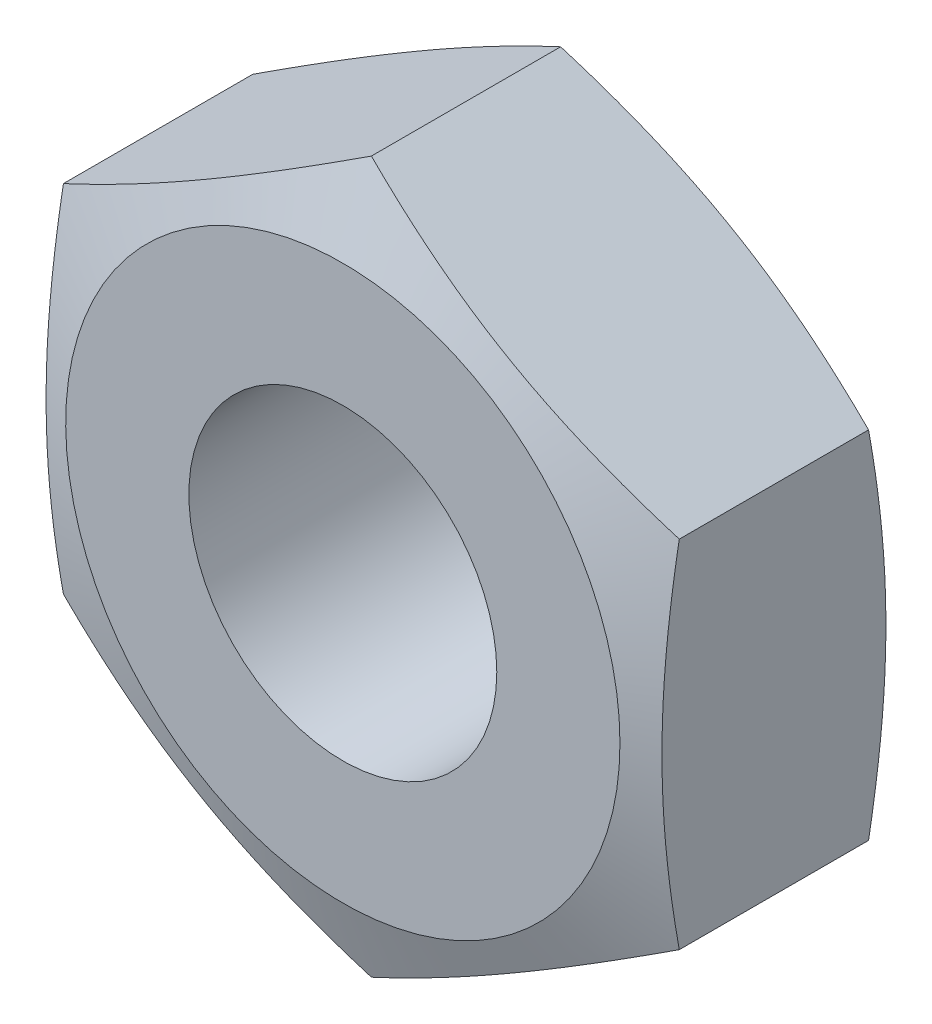
ISO-10303-21;
HEADER;
FILE_DESCRIPTION(('STEP AP214'),'2;1');
FILE_NAME('part.step','',(''),(''),'','','');
FILE_SCHEMA(('AUTOMOTIVE_DESIGN { 1 0 10303 214 1 1 1 1 }'));
ENDSEC;
DATA;
#1=APPLICATION_CONTEXT('core data for automotive mechanical design processes');
#2=APPLICATION_PROTOCOL_DEFINITION('international standard','automotive_design',2000,#1);
#3=PRODUCT_CONTEXT('',#1,'mechanical');
#4=PRODUCT('Part','Part','',(#3));
#5=PRODUCT_RELATED_PRODUCT_CATEGORY('part','',(#4));
#6=PRODUCT_DEFINITION_FORMATION('','',#4);
#7=PRODUCT_DEFINITION_CONTEXT('part definition',#1,'design');
#8=PRODUCT_DEFINITION('design','',#6,#7);
#9=PRODUCT_DEFINITION_SHAPE('','',#8);
#10=(LENGTH_UNIT() NAMED_UNIT(*) SI_UNIT(.MILLI.,.METRE.));
#11=(NAMED_UNIT(*) PLANE_ANGLE_UNIT() SI_UNIT($,.RADIAN.));
#12=(NAMED_UNIT(*) SI_UNIT($,.STERADIAN.) SOLID_ANGLE_UNIT());
#13=UNCERTAINTY_MEASURE_WITH_UNIT(LENGTH_MEASURE(1.E-05),#10,'distance_accuracy_value','');
#14=(GEOMETRIC_REPRESENTATION_CONTEXT(3) GLOBAL_UNCERTAINTY_ASSIGNED_CONTEXT((#13)) GLOBAL_UNIT_ASSIGNED_CONTEXT((#10,
#11,#12)) REPRESENTATION_CONTEXT('',''));
#15=CARTESIAN_POINT('',(0.,0.,0.));
#16=DIRECTION('',(0.,0.,1.));
#17=DIRECTION('',(1.,0.,0.));
#18=AXIS2_PLACEMENT_3D('',#15,#16,#17);
#19=CARTESIAN_POINT('',(2.,1.15470053837925,1.6));
#20=DIRECTION('',(-0.5,-0.866025403784439,0.));
#21=DIRECTION('',(0.866025403784439,-0.5,0.));
#22=AXIS2_PLACEMENT_3D('',#19,#20,#21);
#23=PLANE('',#22);
#24=DIRECTION('',(0.,0.,-1.));
#25=VECTOR('',#24,1.);
#26=CARTESIAN_POINT('',(2.,1.15470053837925,1.6));
#27=LINE('',#26,#25);
#28=CARTESIAN_POINT('',(2.,1.15470053837925,1.41459317075676));
#29=VERTEX_POINT('',#28);
#30=CARTESIAN_POINT('',(2.,1.15470053837925,0.185406829243245));
#31=VERTEX_POINT('',#30);
#32=EDGE_CURVE('E100',#29,#31,#27,.T.);
#33=ORIENTED_EDGE('',*,*,#32,.T.);
#34=CARTESIAN_POINT('',(2.0002,1.15458506832541,0.185448860057708));
#35=CARTESIAN_POINT('',(1.91735915372597,1.20241325322162,0.168032497453669));
#36=CARTESIAN_POINT('',(1.83424509422707,1.25039917784676,0.152189163754237));
#37=CARTESIAN_POINT('',(1.66747643878361,1.34668310595943,0.124315100500139));
#38=CARTESIAN_POINT('',(1.58382147164006,1.39498132375881,0.112287355790318));
#39=CARTESIAN_POINT('',(1.41689959323819,1.49135371518776,0.0928327625088443));
#40=CARTESIAN_POINT('',(1.33363649593117,1.53942568683154,0.0853634711754725));
#41=CARTESIAN_POINT('',(1.16691554252369,1.6356820741609,0.0753450362594957));
#42=CARTESIAN_POINT('',(1.08345777126184,1.68386644086489,0.0727940468532392));
#43=CARTESIAN_POINT('',(0.916542228738157,1.78023517427287,0.0727940468532392));
#44=CARTESIAN_POINT('',(0.833084457476315,1.82841954097686,0.0753450362594957));
#45=CARTESIAN_POINT('',(0.666363504068834,1.92467592830622,0.0853634711754725));
#46=CARTESIAN_POINT('',(0.583100406761807,1.97274789994999,0.0928327625088443));
#47=CARTESIAN_POINT('',(0.416178528359942,2.06912029137895,0.112287355790318));
#48=CARTESIAN_POINT('',(0.332523561216389,2.11741850917833,0.124315100500139));
#49=CARTESIAN_POINT('',(0.165754905772934,2.213702437291,0.152189163754237));
#50=CARTESIAN_POINT('',(0.0826408462740323,2.26168836191613,0.168032497453669));
#51=CARTESIAN_POINT('',(-0.000200000000000283,2.30951654681234,0.185448860057708));
#52=B_SPLINE_CURVE_WITH_KNOTS('',3,(#34,#35,#36,#37,#38,#39,#40,#41,#42,#43,#44,#45,#46,#47,#48,
#49,#50,#51),.UNSPECIFIED.,.F.,.F.,(4,2,2,2,2,2,2,2,4),(0.,0.291716985835478,0.583661615412808,
0.872844804843114,1.16191944356588,1.45099408228865,1.74017727171896,2.03212190129629,
2.32383888713177),.UNSPECIFIED.);
#53=CARTESIAN_POINT('',(0.,2.3094010767585,0.185406829243245));
#54=VERTEX_POINT('',#53);
#55=EDGE_CURVE('E51',#31,#54,#52,.T.);
#56=ORIENTED_EDGE('',*,*,#55,.T.);
#57=DIRECTION('',(0.,0.,-1.));
#58=VECTOR('',#57,1.);
#59=CARTESIAN_POINT('',(0.,2.3094010767585,1.6));
#60=LINE('',#59,#58);
#61=CARTESIAN_POINT('',(0.,2.3094010767585,1.41459317075676));
#62=VERTEX_POINT('',#61);
#63=EDGE_CURVE('E11',#62,#54,#60,.T.);
#64=ORIENTED_EDGE('',*,*,#63,.F.);
#65=CARTESIAN_POINT('',(-0.000200000000000046,2.30951654681234,1.41455113994229));
#66=CARTESIAN_POINT('',(0.0826408462740324,2.26168836191613,1.43196750254633));
#67=CARTESIAN_POINT('',(0.165754905772934,2.213702437291,1.44781083624576));
#68=CARTESIAN_POINT('',(0.332523561216389,2.11741850917833,1.47568489949986));
#69=CARTESIAN_POINT('',(0.416178528359942,2.06912029137895,1.48771264420968));
#70=CARTESIAN_POINT('',(0.583100406761807,1.97274789994999,1.50716723749116));
#71=CARTESIAN_POINT('',(0.666363504068834,1.92467592830622,1.51463652882453));
#72=CARTESIAN_POINT('',(0.833084457476314,1.82841954097686,1.5246549637405));
#73=CARTESIAN_POINT('',(0.916542228738157,1.78023517427287,1.52720595314676));
#74=CARTESIAN_POINT('',(1.08345777126184,1.68386644086489,1.52720595314676));
#75=CARTESIAN_POINT('',(1.16691554252369,1.6356820741609,1.5246549637405));
#76=CARTESIAN_POINT('',(1.33363649593117,1.53942568683154,1.51463652882453));
#77=CARTESIAN_POINT('',(1.41689959323819,1.49135371518776,1.50716723749116));
#78=CARTESIAN_POINT('',(1.58382147164006,1.39498132375881,1.48771264420968));
#79=CARTESIAN_POINT('',(1.66747643878361,1.34668310595943,1.47568489949986));
#80=CARTESIAN_POINT('',(1.83424509422707,1.25039917784676,1.44781083624576));
#81=CARTESIAN_POINT('',(1.91735915372597,1.20241325322162,1.43196750254633));
#82=CARTESIAN_POINT('',(2.0002,1.15458506832541,1.41455113994229));
#83=B_SPLINE_CURVE_WITH_KNOTS('',3,(#65,#66,#67,#68,#69,#70,#71,#72,#73,#74,#75,#76,#77,#78,#79,
#80,#81,#82),.UNSPECIFIED.,.F.,.F.,(4,2,2,2,2,2,2,2,4),(0.,0.291716985835478,0.583661615412808,
0.872844804843114,1.16191944356588,1.45099408228865,1.74017727171896,2.03212190129629,
2.32383888713177),.UNSPECIFIED.);
#84=EDGE_CURVE('E107',#62,#29,#83,.T.);
#85=ORIENTED_EDGE('',*,*,#84,.T.);
#86=EDGE_LOOP('',(#33,#56,#64,#85));
#87=FACE_BOUND('',#86,.T.);
#88=ADVANCED_FACE('F36',(#87),#23,.F.);
#89=CARTESIAN_POINT('',(0.,2.3094010767585,1.6));
#90=DIRECTION('',(0.5,-0.866025403784439,0.));
#91=DIRECTION('',(0.866025403784439,0.5,0.));
#92=AXIS2_PLACEMENT_3D('',#89,#90,#91);
#93=PLANE('',#92);
#94=ORIENTED_EDGE('',*,*,#63,.T.);
#95=CARTESIAN_POINT('',(0.000200000000000007,2.30951654681234,0.185448860057708));
#96=CARTESIAN_POINT('',(-0.0826408462740327,2.26168836191613,0.168032497453669));
#97=CARTESIAN_POINT('',(-0.165754905772935,2.213702437291,0.152189163754237));
#98=CARTESIAN_POINT('',(-0.33252356121639,2.11741850917833,0.124315100500139));
#99=CARTESIAN_POINT('',(-0.416178528359942,2.06912029137895,0.112287355790318));
#100=CARTESIAN_POINT('',(-0.583100406761807,1.97274789994999,0.0928327625088444));
#101=CARTESIAN_POINT('',(-0.666363504068834,1.92467592830622,0.0853634711754725));
#102=CARTESIAN_POINT('',(-0.833084457476315,1.82841954097686,0.0753450362594958));
#103=CARTESIAN_POINT('',(-0.916542228738157,1.78023517427287,0.0727940468532393));
#104=CARTESIAN_POINT('',(-1.08345777126184,1.68386644086489,0.0727940468532393));
#105=CARTESIAN_POINT('',(-1.16691554252369,1.6356820741609,0.0753450362594958));
#106=CARTESIAN_POINT('',(-1.33363649593117,1.53942568683154,0.0853634711754726));
#107=CARTESIAN_POINT('',(-1.41689959323819,1.49135371518776,0.0928327625088445));
#108=CARTESIAN_POINT('',(-1.58382147164006,1.39498132375881,0.112287355790318));
#109=CARTESIAN_POINT('',(-1.66747643878361,1.34668310595943,0.12431510050014));
#110=CARTESIAN_POINT('',(-1.83424509422707,1.25039917784676,0.152189163754238));
#111=CARTESIAN_POINT('',(-1.91735915372597,1.20241325322162,0.168032497453669));
#112=CARTESIAN_POINT('',(-2.0002,1.15458506832541,0.185448860057708));
#113=B_SPLINE_CURVE_WITH_KNOTS('',3,(#95,#96,#97,#98,#99,#100,#101,#102,#103,#104,#105,#106,
#107,#108,#109,#110,#111,#112),.UNSPECIFIED.,.F.,.F.,(4,2,2,2,2,2,2,2,4),(0.,0.291716985835479,
0.583661615412808,0.872844804843114,1.16191944356588,1.45099408228865,1.74017727171896,
2.03212190129629,2.32383888713177),.UNSPECIFIED.);
#114=CARTESIAN_POINT('',(-2.,1.15470053837925,0.185406829243245));
#115=VERTEX_POINT('',#114);
#116=EDGE_CURVE('E87',#54,#115,#113,.T.);
#117=ORIENTED_EDGE('',*,*,#116,.T.);
#118=DIRECTION('',(0.,0.,-1.));
#119=VECTOR('',#118,1.);
#120=CARTESIAN_POINT('',(-2.,1.15470053837925,1.6));
#121=LINE('',#120,#119);
#122=CARTESIAN_POINT('',(-2.,1.15470053837925,1.41459317075676));
#123=VERTEX_POINT('',#122);
#124=EDGE_CURVE('E44',#123,#115,#121,.T.);
#125=ORIENTED_EDGE('',*,*,#124,.F.);
#126=CARTESIAN_POINT('',(-2.0002,1.15458506832541,1.41455113994229));
#127=CARTESIAN_POINT('',(-1.91735915372597,1.20241325322162,1.43196750254633));
#128=CARTESIAN_POINT('',(-1.83424509422707,1.25039917784676,1.44781083624576));
#129=CARTESIAN_POINT('',(-1.66747643878361,1.34668310595943,1.47568489949986));
#130=CARTESIAN_POINT('',(-1.58382147164006,1.39498132375881,1.48771264420968));
#131=CARTESIAN_POINT('',(-1.41689959323819,1.49135371518776,1.50716723749116));
#132=CARTESIAN_POINT('',(-1.33363649593117,1.53942568683154,1.51463652882453));
#133=CARTESIAN_POINT('',(-1.16691554252369,1.6356820741609,1.5246549637405));
#134=CARTESIAN_POINT('',(-1.08345777126184,1.68386644086489,1.52720595314676));
#135=CARTESIAN_POINT('',(-0.916542228738157,1.78023517427287,1.52720595314676));
#136=CARTESIAN_POINT('',(-0.833084457476314,1.82841954097686,1.5246549637405));
#137=CARTESIAN_POINT('',(-0.666363504068834,1.92467592830622,1.51463652882453));
#138=CARTESIAN_POINT('',(-0.583100406761807,1.97274789994999,1.50716723749116));
#139=CARTESIAN_POINT('',(-0.416178528359942,2.06912029137895,1.48771264420968));
#140=CARTESIAN_POINT('',(-0.332523561216389,2.11741850917833,1.47568489949986));
#141=CARTESIAN_POINT('',(-0.165754905772934,2.213702437291,1.44781083624576));
#142=CARTESIAN_POINT('',(-0.0826408462740324,2.26168836191613,1.43196750254633));
#143=CARTESIAN_POINT('',(0.000200000000000356,2.30951654681234,1.41455113994229));
#144=B_SPLINE_CURVE_WITH_KNOTS('',3,(#126,#127,#128,#129,#130,#131,#132,#133,#134,#135,#136,
#137,#138,#139,#140,#141,#142,#143),.UNSPECIFIED.,.F.,.F.,(4,2,2,2,2,2,2,2,4),(0.,
0.291716985835479,0.583661615412808,0.872844804843114,1.16191944356588,1.45099408228865,
1.74017727171896,2.03212190129629,2.32383888713177),.UNSPECIFIED.);
#145=EDGE_CURVE('E105',#123,#62,#144,.T.);
#146=ORIENTED_EDGE('',*,*,#145,.T.);
#147=EDGE_LOOP('',(#94,#117,#125,#146));
#148=FACE_BOUND('',#147,.T.);
#149=ADVANCED_FACE('F104',(#148),#93,.F.);
#150=CARTESIAN_POINT('',(-2.,1.15470053837925,1.6));
#151=DIRECTION('',(1.,0.,0.));
#152=DIRECTION('',(0.,0.,-1.));
#153=AXIS2_PLACEMENT_3D('',#150,#151,#152);
#154=PLANE('',#153);
#155=ORIENTED_EDGE('',*,*,#124,.T.);
#156=CARTESIAN_POINT('',(-2.,-3.05031162677116,0.672442230833341));
#157=CARTESIAN_POINT('',(-2.,-2.95989490218837,0.644928781621238));
#158=CARTESIAN_POINT('',(-2.,-2.86937822648628,0.617738484155107));
#159=CARTESIAN_POINT('',(-2.,-2.68809399605257,0.564181531550267));
#160=CARTESIAN_POINT('',(-2.,-2.59732642193118,0.537814942122395));
#161=CARTESIAN_POINT('',(-2.,-2.41533254134479,0.486038459734253));
#162=CARTESIAN_POINT('',(-2.,-2.32410569283579,0.460630462485751));
#163=CARTESIAN_POINT('',(-2.,-2.14131199638906,0.411076127854906));
#164=CARTESIAN_POINT('',(-2.,-2.04974515463943,0.386929767629361));
#165=CARTESIAN_POINT('',(-2.,-1.7767394508647,0.317402866114399));
#166=CARTESIAN_POINT('',(-2.,-1.59471676185193,0.27427186797954));
#167=CARTESIAN_POINT('',(-2.,-1.22866663109293,0.197458745362041));
#168=CARTESIAN_POINT('',(-2.,-1.04464009031412,0.163772542904175));
#169=CARTESIAN_POINT('',(-2.,-0.777440999728752,0.125375528147598));
#170=CARTESIAN_POINT('',(-2.,-0.695088061294178,0.114968442052623));
#171=CARTESIAN_POINT('',(-2.,-0.5300428651665,0.0973765876551359));
#172=CARTESIAN_POINT('',(-2.,-0.447350650850818,0.090191419626845));
#173=CARTESIAN_POINT('',(-2.,-0.281784370385069,0.0793865670193495));
#174=CARTESIAN_POINT('',(-2.,-0.198910458457961,0.0757645546304802));
#175=CARTESIAN_POINT('',(-2.,-0.0330826983595107,0.0722701306170606));
#176=CARTESIAN_POINT('',(-2.,0.0498711492808819,0.072397694256397));
#177=CARTESIAN_POINT('',(-2.,0.216111891745599,0.0764055645531487));
#178=CARTESIAN_POINT('',(-2.,0.299398315404806,0.0803050948444768));
#179=CARTESIAN_POINT('',(-2.,0.465727625088114,0.091678055629401));
#180=CARTESIAN_POINT('',(-2.,0.548770496202853,0.099151700504532));
#181=CARTESIAN_POINT('',(-2.,0.714568331999549,0.11732382152012));
#182=CARTESIAN_POINT('',(-2.,0.797322996390511,0.128025000152161));
#183=CARTESIAN_POINT('',(-2.,0.962417154472956,0.152223143304533));
#184=CARTESIAN_POINT('',(-2.,1.04475664618065,0.165720121170871));
#185=CARTESIAN_POINT('',(-2.,1.30100491224258,0.211494089126808));
#186=CARTESIAN_POINT('',(-2.,1.47417881069313,0.247873366845185));
#187=CARTESIAN_POINT('',(-2.,1.81891373011319,0.327623197419252));
#188=CARTESIAN_POINT('',(-2.,1.99047413904239,0.370996298320652));
#189=CARTESIAN_POINT('',(-2.,2.33257919607591,0.462393272044698));
#190=CARTESIAN_POINT('',(-2.,2.50312222940243,0.510423131074273));
#191=CARTESIAN_POINT('',(-2.,2.84327352184795,0.609557392962974));
#192=CARTESIAN_POINT('',(-2.,3.0128819264062,0.660661301818513));
#193=CARTESIAN_POINT('',(-2.,3.34951260232018,0.764399312077172));
#194=CARTESIAN_POINT('',(-2.,3.51654232342241,0.817009349169206));
#195=CARTESIAN_POINT('',(-2.,3.85013442656059,0.923713468364503));
#196=CARTESIAN_POINT('',(-2.,4.01669678547734,0.977807622504826));
#197=CARTESIAN_POINT('',(-2.,4.34883250367105,1.08686895790735));
#198=CARTESIAN_POINT('',(-2.,4.51440721447674,1.14183203356738));
#199=CARTESIAN_POINT('',(-2.,4.84526800434378,1.25257579516433));
#200=CARTESIAN_POINT('',(-2.,5.01055410611518,1.30835641319565));
#201=CARTESIAN_POINT('',(-2.,5.17574181927481,1.3644228160933));
#202=B_SPLINE_CURVE_WITH_KNOTS('',3,(#156,#157,#158,#159,#160,#161,#162,#163,#164,#165,#166,
#167,#168,#169,#170,#171,#172,#173,#174,#175,#176,#177,#178,#179,#180,#181,#182,#183,#184,#185,
#186,#187,#188,#189,#190,#191,#192,#193,#194,#195,#196,#197,#198,#199,#200,#201),.UNSPECIFIED.,
.F.,.F.,(4,2,2,2,2,2,2,2,2,2,2,2,2,2,2,2,2,2,2,2,2,2,4),(0.,0.283532151624477,0.567086864403373,
0.851175716010968,1.13525942212174,1.69631085076014,2.25711966010779,2.50609066615215,
2.75503077517164,3.00380814339452,3.25258387042284,3.50263418686682,3.75269950364003,
4.00297479017142,4.25325127144275,4.78385307907594,5.31464863841295,5.8461358115385,
6.37753780102535,6.90288601730338,7.42825977855363,7.95163426467287,8.47496552259563),.UNSPECIFIED.);
#203=CARTESIAN_POINT('',(-2.,-1.15470053837925,0.185406829243245));
#204=VERTEX_POINT('',#203);
#205=EDGE_CURVE('E90',#115,#204,#202,.F.);
#206=ORIENTED_EDGE('',*,*,#205,.T.);
#207=DIRECTION('',(0.,0.,-1.));
#208=VECTOR('',#207,1.);
#209=CARTESIAN_POINT('',(-2.,-1.15470053837925,1.6));
#210=LINE('',#209,#208);
#211=CARTESIAN_POINT('',(-2.,-1.15470053837925,1.41459317075676));
#212=VERTEX_POINT('',#211);
#213=EDGE_CURVE('E216',#212,#204,#210,.T.);
#214=ORIENTED_EDGE('',*,*,#213,.F.);
#215=CARTESIAN_POINT('',(-2.,-3.05031162677116,0.927557769166659));
#216=CARTESIAN_POINT('',(-2.,-2.95989490218837,0.955071218378762));
#217=CARTESIAN_POINT('',(-2.,-2.86937822648628,0.982261515844894));
#218=CARTESIAN_POINT('',(-2.,-2.68809399605256,1.03581846844973));
#219=CARTESIAN_POINT('',(-2.,-2.59732642193118,1.06218505787761));
#220=CARTESIAN_POINT('',(-2.,-2.41533254134479,1.11396154026575));
#221=CARTESIAN_POINT('',(-2.,-2.32410569283579,1.13936953751425));
#222=CARTESIAN_POINT('',(-2.,-2.14131199638906,1.18892387214509));
#223=CARTESIAN_POINT('',(-2.,-2.04974515463943,1.21307023237064));
#224=CARTESIAN_POINT('',(-2.,-1.7767394508647,1.2825971338856));
#225=CARTESIAN_POINT('',(-2.,-1.59471676185193,1.32572813202046));
#226=CARTESIAN_POINT('',(-2.,-1.22866663109293,1.40254125463796));
#227=CARTESIAN_POINT('',(-2.,-1.04464009031412,1.43622745709583));
#228=CARTESIAN_POINT('',(-2.,-0.777440999728752,1.4746244718524));
#229=CARTESIAN_POINT('',(-2.,-0.695088061294179,1.48503155794738));
#230=CARTESIAN_POINT('',(-2.,-0.530042865166501,1.50262341234486));
#231=CARTESIAN_POINT('',(-2.,-0.447350650850819,1.50980858037315));
#232=CARTESIAN_POINT('',(-2.,-0.28178437038507,1.52061343298065));
#233=CARTESIAN_POINT('',(-2.,-0.198910458457961,1.52423544536952));
#234=CARTESIAN_POINT('',(-2.,-0.0330826983595114,1.52772986938294));
#235=CARTESIAN_POINT('',(-2.,0.0498711492808811,1.5276023057436));
#236=CARTESIAN_POINT('',(-2.,0.216111891745599,1.52359443544685));
#237=CARTESIAN_POINT('',(-2.,0.299398315404805,1.51969490515552));
#238=CARTESIAN_POINT('',(-2.,0.465727625088113,1.5083219443706));
#239=CARTESIAN_POINT('',(-2.,0.548770496202853,1.50084829949547));
#240=CARTESIAN_POINT('',(-2.,0.714568331999549,1.48267617847988));
#241=CARTESIAN_POINT('',(-2.,0.797322996390511,1.47197499984784));
#242=CARTESIAN_POINT('',(-2.,0.962417154472955,1.44777685669547));
#243=CARTESIAN_POINT('',(-2.,1.04475664618065,1.43427987882913));
#244=CARTESIAN_POINT('',(-2.,1.30100491224258,1.38850591087319));
#245=CARTESIAN_POINT('',(-2.,1.47417881069313,1.35212663315482));
#246=CARTESIAN_POINT('',(-2.,1.81891373011319,1.27237680258075));
#247=CARTESIAN_POINT('',(-2.,1.99047413904238,1.22900370167935));
#248=CARTESIAN_POINT('',(-2.,2.33257919607591,1.1376067279553));
#249=CARTESIAN_POINT('',(-2.,2.50312222940243,1.08957686892573));
#250=CARTESIAN_POINT('',(-2.,2.84327352184795,0.990442607037026));
#251=CARTESIAN_POINT('',(-2.,3.0128819264062,0.939338698181486));
#252=CARTESIAN_POINT('',(-2.,3.34951260232018,0.835600687922827));
#253=CARTESIAN_POINT('',(-2.,3.51654232342241,0.782990650830793));
#254=CARTESIAN_POINT('',(-2.,3.85013442656059,0.676286531635496));
#255=CARTESIAN_POINT('',(-2.,4.01669678547735,0.622192377495174));
#256=CARTESIAN_POINT('',(-2.,4.34883250367105,0.51313104209265));
#257=CARTESIAN_POINT('',(-2.,4.51440721447674,0.458167966432621));
#258=CARTESIAN_POINT('',(-2.,4.84526800434378,0.34742420483567));
#259=CARTESIAN_POINT('',(-2.,5.01055410611518,0.291643586804349));
#260=CARTESIAN_POINT('',(-2.,5.17574181927481,0.235577183906703));
#261=B_SPLINE_CURVE_WITH_KNOTS('',3,(#215,#216,#217,#218,#219,#220,#221,#222,#223,#224,#225,
#226,#227,#228,#229,#230,#231,#232,#233,#234,#235,#236,#237,#238,#239,#240,#241,#242,#243,#244,
#245,#246,#247,#248,#249,#250,#251,#252,#253,#254,#255,#256,#257,#258,#259,#260),.UNSPECIFIED.,
.F.,.F.,(4,2,2,2,2,2,2,2,2,2,2,2,2,2,2,2,2,2,2,2,2,2,4),(0.,0.283532151624478,0.567086864403374,
0.85117571601097,1.13525942212175,1.69631085076014,2.25711966010779,2.50609066615215,
2.75503077517164,3.00380814339452,3.25258387042284,3.50263418686682,3.75269950364003,
4.00297479017142,4.25325127144275,4.78385307907594,5.31464863841295,5.8461358115385,
6.37753780102535,6.90288601730338,7.42825977855364,7.95163426467287,8.47496552259563),.UNSPECIFIED.);
#262=EDGE_CURVE('E108',#212,#123,#261,.T.);
#263=ORIENTED_EDGE('',*,*,#262,.T.);
#264=EDGE_LOOP('',(#155,#206,#214,#263));
#265=FACE_BOUND('',#264,.T.);
#266=ADVANCED_FACE('F170',(#265),#154,.F.);
#267=CARTESIAN_POINT('',(-2.,-1.15470053837925,1.6));
#268=DIRECTION('',(0.5,0.866025403784439,0.));
#269=DIRECTION('',(-0.866025403784439,0.5,0.));
#270=AXIS2_PLACEMENT_3D('',#267,#268,#269);
#271=PLANE('',#270);
#272=ORIENTED_EDGE('',*,*,#213,.T.);
#273=CARTESIAN_POINT('',(-2.0002,-1.15458506832541,0.185448860057708));
#274=CARTESIAN_POINT('',(-1.91735915372597,-1.20241325322162,0.168032497453669));
#275=CARTESIAN_POINT('',(-1.83424509422707,-1.25039917784676,0.152189163754237));
#276=CARTESIAN_POINT('',(-1.66747643878361,-1.34668310595943,0.124315100500139));
#277=CARTESIAN_POINT('',(-1.58382147164006,-1.39498132375881,0.112287355790318));
#278=CARTESIAN_POINT('',(-1.41689959323819,-1.49135371518776,0.0928327625088444));
#279=CARTESIAN_POINT('',(-1.33363649593117,-1.53942568683154,0.0853634711754726));
#280=CARTESIAN_POINT('',(-1.16691554252369,-1.63568207416089,0.0753450362594957));
#281=CARTESIAN_POINT('',(-1.08345777126184,-1.68386644086489,0.0727940468532391));
#282=CARTESIAN_POINT('',(-0.916542228738157,-1.78023517427287,0.0727940468532391));
#283=CARTESIAN_POINT('',(-0.833084457476315,-1.82841954097686,0.0753450362594957));
#284=CARTESIAN_POINT('',(-0.666363504068834,-1.92467592830622,0.0853634711754726));
#285=CARTESIAN_POINT('',(-0.583100406761807,-1.97274789994999,0.0928327625088444));
#286=CARTESIAN_POINT('',(-0.416178528359942,-2.06912029137895,0.112287355790318));
#287=CARTESIAN_POINT('',(-0.332523561216389,-2.11741850917833,0.124315100500139));
#288=CARTESIAN_POINT('',(-0.165754905772934,-2.213702437291,0.152189163754237));
#289=CARTESIAN_POINT('',(-0.0826408462740323,-2.26168836191613,0.168032497453669));
#290=CARTESIAN_POINT('',(0.000200000000000217,-2.30951654681234,0.185448860057708));
#291=B_SPLINE_CURVE_WITH_KNOTS('',3,(#273,#274,#275,#276,#277,#278,#279,#280,#281,#282,#283,
#284,#285,#286,#287,#288,#289,#290),.UNSPECIFIED.,.F.,.F.,(4,2,2,2,2,2,2,2,4),(0.,
0.291716985835479,0.583661615412808,0.872844804843114,1.16191944356588,1.45099408228865,
1.74017727171896,2.03212190129629,2.32383888713177),.UNSPECIFIED.);
#292=CARTESIAN_POINT('',(0.,-2.3094010767585,0.185406829243245));
#293=VERTEX_POINT('',#292);
#294=EDGE_CURVE('E176',#204,#293,#291,.T.);
#295=ORIENTED_EDGE('',*,*,#294,.T.);
#296=DIRECTION('',(0.,0.,-1.));
#297=VECTOR('',#296,1.);
#298=CARTESIAN_POINT('',(0.,-2.3094010767585,1.6));
#299=LINE('',#298,#297);
#300=CARTESIAN_POINT('',(0.,-2.3094010767585,1.41459317075676));
#301=VERTEX_POINT('',#300);
#302=EDGE_CURVE('E212',#301,#293,#299,.T.);
#303=ORIENTED_EDGE('',*,*,#302,.F.);
#304=CARTESIAN_POINT('',(0.000200000000000047,-2.30951654681234,1.41455113994229));
#305=CARTESIAN_POINT('',(-0.0826408462740324,-2.26168836191613,1.43196750254633));
#306=CARTESIAN_POINT('',(-0.165754905772934,-2.213702437291,1.44781083624576));
#307=CARTESIAN_POINT('',(-0.33252356121639,-2.11741850917833,1.47568489949986));
#308=CARTESIAN_POINT('',(-0.416178528359942,-2.06912029137895,1.48771264420968));
#309=CARTESIAN_POINT('',(-0.583100406761807,-1.97274789994999,1.50716723749116));
#310=CARTESIAN_POINT('',(-0.666363504068834,-1.92467592830622,1.51463652882453));
#311=CARTESIAN_POINT('',(-0.833084457476315,-1.82841954097686,1.5246549637405));
#312=CARTESIAN_POINT('',(-0.916542228738157,-1.78023517427287,1.52720595314676));
#313=CARTESIAN_POINT('',(-1.08345777126184,-1.68386644086489,1.52720595314676));
#314=CARTESIAN_POINT('',(-1.16691554252369,-1.63568207416089,1.5246549637405));
#315=CARTESIAN_POINT('',(-1.33363649593117,-1.53942568683153,1.51463652882453));
#316=CARTESIAN_POINT('',(-1.41689959323819,-1.49135371518776,1.50716723749116));
#317=CARTESIAN_POINT('',(-1.58382147164006,-1.39498132375881,1.48771264420968));
#318=CARTESIAN_POINT('',(-1.66747643878361,-1.34668310595943,1.47568489949986));
#319=CARTESIAN_POINT('',(-1.83424509422707,-1.25039917784676,1.44781083624576));
#320=CARTESIAN_POINT('',(-1.91735915372597,-1.20241325322162,1.43196750254633));
#321=CARTESIAN_POINT('',(-2.0002,-1.15458506832541,1.41455113994229));
#322=B_SPLINE_CURVE_WITH_KNOTS('',3,(#304,#305,#306,#307,#308,#309,#310,#311,#312,#313,#314,
#315,#316,#317,#318,#319,#320,#321),.UNSPECIFIED.,.F.,.F.,(4,2,2,2,2,2,2,2,4),(0.,
0.291716985835479,0.583661615412808,0.872844804843114,1.16191944356588,1.45099408228865,
1.74017727171896,2.03212190129629,2.32383888713177),.UNSPECIFIED.);
#323=EDGE_CURVE('E111',#301,#212,#322,.T.);
#324=ORIENTED_EDGE('',*,*,#323,.T.);
#325=EDGE_LOOP('',(#272,#295,#303,#324));
#326=FACE_BOUND('',#325,.T.);
#327=ADVANCED_FACE('F166',(#326),#271,.F.);
#328=CARTESIAN_POINT('',(0.,-2.3094010767585,1.6));
#329=DIRECTION('',(-0.5,0.866025403784439,0.));
#330=DIRECTION('',(-0.866025403784439,-0.5,0.));
#331=AXIS2_PLACEMENT_3D('',#328,#329,#330);
#332=PLANE('',#331);
#333=ORIENTED_EDGE('',*,*,#302,.T.);
#334=CARTESIAN_POINT('',(-0.000200000000000006,-2.30951654681234,0.185448860057708));
#335=CARTESIAN_POINT('',(0.0826408462740324,-2.26168836191613,0.168032497453669));
#336=CARTESIAN_POINT('',(0.165754905772934,-2.213702437291,0.152189163754237));
#337=CARTESIAN_POINT('',(0.332523561216389,-2.11741850917833,0.124315100500139));
#338=CARTESIAN_POINT('',(0.416178528359942,-2.06912029137895,0.112287355790318));
#339=CARTESIAN_POINT('',(0.583100406761807,-1.97274789994999,0.0928327625088445));
#340=CARTESIAN_POINT('',(0.666363504068834,-1.92467592830622,0.0853634711754728));
#341=CARTESIAN_POINT('',(0.833084457476314,-1.82841954097686,0.0753450362594959));
#342=CARTESIAN_POINT('',(0.916542228738157,-1.78023517427287,0.0727940468532393));
#343=CARTESIAN_POINT('',(1.08345777126184,-1.68386644086489,0.0727940468532393));
#344=CARTESIAN_POINT('',(1.16691554252369,-1.6356820741609,0.075345036259496));
#345=CARTESIAN_POINT('',(1.33363649593117,-1.53942568683154,0.0853634711754729));
#346=CARTESIAN_POINT('',(1.41689959323819,-1.49135371518776,0.0928327625088446));
#347=CARTESIAN_POINT('',(1.58382147164006,-1.39498132375881,0.112287355790318));
#348=CARTESIAN_POINT('',(1.66747643878361,-1.34668310595943,0.12431510050014));
#349=CARTESIAN_POINT('',(1.83424509422707,-1.25039917784676,0.152189163754237));
#350=CARTESIAN_POINT('',(1.91735915372597,-1.20241325322162,0.168032497453669));
#351=CARTESIAN_POINT('',(2.0002,-1.15458506832541,0.185448860057708));
#352=B_SPLINE_CURVE_WITH_KNOTS('',3,(#334,#335,#336,#337,#338,#339,#340,#341,#342,#343,#344,
#345,#346,#347,#348,#349,#350,#351),.UNSPECIFIED.,.F.,.F.,(4,2,2,2,2,2,2,2,4),(0.,
0.291716985835479,0.583661615412808,0.872844804843114,1.16191944356588,1.45099408228865,
1.74017727171896,2.03212190129629,2.32383888713177),.UNSPECIFIED.);
#353=CARTESIAN_POINT('',(2.,-1.15470053837925,0.185406829243245));
#354=VERTEX_POINT('',#353);
#355=EDGE_CURVE('E184',#293,#354,#352,.T.);
#356=ORIENTED_EDGE('',*,*,#355,.T.);
#357=DIRECTION('',(0.,0.,-1.));
#358=VECTOR('',#357,1.);
#359=CARTESIAN_POINT('',(2.,-1.15470053837925,1.6));
#360=LINE('',#359,#358);
#361=CARTESIAN_POINT('',(2.,-1.15470053837925,1.41459317075676));
#362=VERTEX_POINT('',#361);
#363=EDGE_CURVE('E213',#362,#354,#360,.T.);
#364=ORIENTED_EDGE('',*,*,#363,.F.);
#365=CARTESIAN_POINT('',(2.0002,-1.15458506832541,1.41455113994229));
#366=CARTESIAN_POINT('',(1.91735915372597,-1.20241325322162,1.43196750254633));
#367=CARTESIAN_POINT('',(1.83424509422707,-1.25039917784676,1.44781083624576));
#368=CARTESIAN_POINT('',(1.66747643878361,-1.34668310595943,1.47568489949986));
#369=CARTESIAN_POINT('',(1.58382147164006,-1.39498132375881,1.48771264420968));
#370=CARTESIAN_POINT('',(1.41689959323819,-1.49135371518776,1.50716723749116));
#371=CARTESIAN_POINT('',(1.33363649593117,-1.53942568683154,1.51463652882453));
#372=CARTESIAN_POINT('',(1.16691554252369,-1.6356820741609,1.5246549637405));
#373=CARTESIAN_POINT('',(1.08345777126184,-1.68386644086489,1.52720595314676));
#374=CARTESIAN_POINT('',(0.916542228738157,-1.78023517427287,1.52720595314676));
#375=CARTESIAN_POINT('',(0.833084457476314,-1.82841954097686,1.5246549637405));
#376=CARTESIAN_POINT('',(0.666363504068834,-1.92467592830622,1.51463652882453));
#377=CARTESIAN_POINT('',(0.583100406761807,-1.97274789994999,1.50716723749116));
#378=CARTESIAN_POINT('',(0.416178528359942,-2.06912029137895,1.48771264420968));
#379=CARTESIAN_POINT('',(0.332523561216389,-2.11741850917833,1.47568489949986));
#380=CARTESIAN_POINT('',(0.165754905772934,-2.213702437291,1.44781083624576));
#381=CARTESIAN_POINT('',(0.0826408462740324,-2.26168836191613,1.43196750254633));
#382=CARTESIAN_POINT('',(-0.00020000000000032,-2.30951654681234,1.41455113994229));
#383=B_SPLINE_CURVE_WITH_KNOTS('',3,(#365,#366,#367,#368,#369,#370,#371,#372,#373,#374,#375,
#376,#377,#378,#379,#380,#381,#382),.UNSPECIFIED.,.F.,.F.,(4,2,2,2,2,2,2,2,4),(0.,
0.291716985835478,0.583661615412808,0.872844804843114,1.16191944356588,1.45099408228865,
1.74017727171896,2.03212190129629,2.32383888713177),.UNSPECIFIED.);
#384=EDGE_CURVE('E59',#362,#301,#383,.T.);
#385=ORIENTED_EDGE('',*,*,#384,.T.);
#386=EDGE_LOOP('',(#333,#356,#364,#385));
#387=FACE_BOUND('',#386,.T.);
#388=ADVANCED_FACE('F169',(#387),#332,.F.);
#389=CARTESIAN_POINT('',(2.,-1.15470053837925,1.6));
#390=DIRECTION('',(-1.,0.,0.));
#391=DIRECTION('',(0.,0.,1.));
#392=AXIS2_PLACEMENT_3D('',#389,#390,#391);
#393=PLANE('',#392);
#394=ORIENTED_EDGE('',*,*,#363,.T.);
#395=CARTESIAN_POINT('',(2.,-3.05031162677116,0.672442230833342));
#396=CARTESIAN_POINT('',(2.,-2.95989490218837,0.644928781621239));
#397=CARTESIAN_POINT('',(2.,-2.86937822648628,0.617738484155107));
#398=CARTESIAN_POINT('',(2.,-2.68809399605257,0.564181531550267));
#399=CARTESIAN_POINT('',(2.,-2.59732642193118,0.537814942122395));
#400=CARTESIAN_POINT('',(2.,-2.41533254134479,0.486038459734253));
#401=CARTESIAN_POINT('',(2.,-2.32410569283579,0.460630462485751));
#402=CARTESIAN_POINT('',(2.,-2.14131199638906,0.411076127854906));
#403=CARTESIAN_POINT('',(2.,-2.04974515463943,0.386929767629361));
#404=CARTESIAN_POINT('',(2.,-1.7767394508647,0.317402866114399));
#405=CARTESIAN_POINT('',(2.,-1.59471676185193,0.27427186797954));
#406=CARTESIAN_POINT('',(2.,-1.22866663109293,0.197458745362041));
#407=CARTESIAN_POINT('',(2.,-1.04464009031412,0.163772542904175));
#408=CARTESIAN_POINT('',(2.,-0.777440999728754,0.125375528147598));
#409=CARTESIAN_POINT('',(2.,-0.69508806129418,0.114968442052623));
#410=CARTESIAN_POINT('',(2.,-0.530042865166502,0.0973765876551359));
#411=CARTESIAN_POINT('',(2.,-0.44735065085082,0.090191419626845));
#412=CARTESIAN_POINT('',(2.,-0.281784370385071,0.0793865670193495));
#413=CARTESIAN_POINT('',(2.,-0.198910458457963,0.0757645546304801));
#414=CARTESIAN_POINT('',(2.,-0.0330826983595126,0.0722701306170603));
#415=CARTESIAN_POINT('',(2.,0.0498711492808799,0.0723976942563967));
#416=CARTESIAN_POINT('',(2.,0.216111891745597,0.0764055645531484));
#417=CARTESIAN_POINT('',(2.,0.299398315404804,0.0803050948444764));
#418=CARTESIAN_POINT('',(2.,0.465727625088112,0.0916780556294008));
#419=CARTESIAN_POINT('',(2.,0.548770496202852,0.0991517005045318));
#420=CARTESIAN_POINT('',(2.,0.714568331999548,0.11732382152012));
#421=CARTESIAN_POINT('',(2.,0.79732299639051,0.128025000152161));
#422=CARTESIAN_POINT('',(2.,0.962417154472955,0.152223143304532));
#423=CARTESIAN_POINT('',(2.,1.04475664618065,0.165720121170871));
#424=CARTESIAN_POINT('',(2.,1.30100491224258,0.211494089126808));
#425=CARTESIAN_POINT('',(2.,1.47417881069313,0.247873366845185));
#426=CARTESIAN_POINT('',(2.,1.81891373011319,0.327623197419252));
#427=CARTESIAN_POINT('',(2.,1.99047413904239,0.370996298320652));
#428=CARTESIAN_POINT('',(2.,2.33257919607592,0.462393272044698));
#429=CARTESIAN_POINT('',(2.,2.50312222940243,0.510423131074274));
#430=CARTESIAN_POINT('',(2.,2.84327352184796,0.609557392962974));
#431=CARTESIAN_POINT('',(2.,3.0128819264062,0.660661301818514));
#432=CARTESIAN_POINT('',(2.,3.34951260232018,0.764399312077173));
#433=CARTESIAN_POINT('',(2.,3.51654232342241,0.817009349169207));
#434=CARTESIAN_POINT('',(2.,3.85013442656059,0.923713468364504));
#435=CARTESIAN_POINT('',(2.,4.01669678547735,0.977807622504826));
#436=CARTESIAN_POINT('',(2.,4.34883250367105,1.08686895790735));
#437=CARTESIAN_POINT('',(2.,4.51440721447674,1.14183203356738));
#438=CARTESIAN_POINT('',(2.,4.84526800434378,1.25257579516433));
#439=CARTESIAN_POINT('',(2.,5.01055410611518,1.30835641319565));
#440=CARTESIAN_POINT('',(2.,5.17574181927481,1.3644228160933));
#441=B_SPLINE_CURVE_WITH_KNOTS('',3,(#395,#396,#397,#398,#399,#400,#401,#402,#403,#404,#405,
#406,#407,#408,#409,#410,#411,#412,#413,#414,#415,#416,#417,#418,#419,#420,#421,#422,#423,#424,
#425,#426,#427,#428,#429,#430,#431,#432,#433,#434,#435,#436,#437,#438,#439,#440),.UNSPECIFIED.,
.F.,.F.,(4,2,2,2,2,2,2,2,2,2,2,2,2,2,2,2,2,2,2,2,2,2,4),(0.,0.283532151624478,0.567086864403375,
0.85117571601097,1.13525942212175,1.69631085076014,2.25711966010778,2.50609066615215,
2.75503077517164,3.00380814339452,3.25258387042284,3.50263418686682,3.75269950364003,
4.00297479017142,4.25325127144275,4.78385307907594,5.31464863841295,5.84613581153851,
6.37753780102536,6.90288601730339,7.42825977855364,7.95163426467287,8.47496552259563),.UNSPECIFIED.);
#442=EDGE_CURVE('E310',#354,#31,#441,.T.);
#443=ORIENTED_EDGE('',*,*,#442,.T.);
#444=ORIENTED_EDGE('',*,*,#32,.F.);
#445=CARTESIAN_POINT('',(2.,-3.05031162677116,0.927557769166658));
#446=CARTESIAN_POINT('',(2.,-2.95989490218837,0.955071218378761));
#447=CARTESIAN_POINT('',(2.,-2.86937822648628,0.982261515844893));
#448=CARTESIAN_POINT('',(2.,-2.68809399605257,1.03581846844973));
#449=CARTESIAN_POINT('',(2.,-2.59732642193118,1.06218505787761));
#450=CARTESIAN_POINT('',(2.,-2.41533254134479,1.11396154026575));
#451=CARTESIAN_POINT('',(2.,-2.32410569283579,1.13936953751425));
#452=CARTESIAN_POINT('',(2.,-2.14131199638906,1.18892387214509));
#453=CARTESIAN_POINT('',(2.,-2.04974515463943,1.21307023237064));
#454=CARTESIAN_POINT('',(2.,-1.7767394508647,1.2825971338856));
#455=CARTESIAN_POINT('',(2.,-1.59471676185193,1.32572813202046));
#456=CARTESIAN_POINT('',(2.,-1.22866663109293,1.40254125463796));
#457=CARTESIAN_POINT('',(2.,-1.04464009031412,1.43622745709583));
#458=CARTESIAN_POINT('',(2.,-0.777440999728753,1.4746244718524));
#459=CARTESIAN_POINT('',(2.,-0.69508806129418,1.48503155794738));
#460=CARTESIAN_POINT('',(2.,-0.530042865166502,1.50262341234486));
#461=CARTESIAN_POINT('',(2.,-0.44735065085082,1.50980858037315));
#462=CARTESIAN_POINT('',(2.,-0.28178437038507,1.52061343298065));
#463=CARTESIAN_POINT('',(2.,-0.198910458457962,1.52423544536952));
#464=CARTESIAN_POINT('',(2.,-0.0330826983595119,1.52772986938294));
#465=CARTESIAN_POINT('',(2.,0.0498711492808807,1.5276023057436));
#466=CARTESIAN_POINT('',(2.,0.216111891745598,1.52359443544685));
#467=CARTESIAN_POINT('',(2.,0.299398315404804,1.51969490515552));
#468=CARTESIAN_POINT('',(2.,0.465727625088113,1.5083219443706));
#469=CARTESIAN_POINT('',(2.,0.548770496202852,1.50084829949547));
#470=CARTESIAN_POINT('',(2.,0.714568331999548,1.48267617847988));
#471=CARTESIAN_POINT('',(2.,0.79732299639051,1.47197499984784));
#472=CARTESIAN_POINT('',(2.,0.962417154472955,1.44777685669547));
#473=CARTESIAN_POINT('',(2.,1.04475664618065,1.43427987882913));
#474=CARTESIAN_POINT('',(2.,1.30100491224258,1.38850591087319));
#475=CARTESIAN_POINT('',(2.,1.47417881069313,1.35212663315482));
#476=CARTESIAN_POINT('',(2.,1.81891373011319,1.27237680258075));
#477=CARTESIAN_POINT('',(2.,1.99047413904238,1.22900370167935));
#478=CARTESIAN_POINT('',(2.,2.33257919607591,1.1376067279553));
#479=CARTESIAN_POINT('',(2.,2.50312222940243,1.08957686892573));
#480=CARTESIAN_POINT('',(2.,2.84327352184795,0.990442607037026));
#481=CARTESIAN_POINT('',(2.,3.0128819264062,0.939338698181487));
#482=CARTESIAN_POINT('',(2.,3.34951260232018,0.835600687922828));
#483=CARTESIAN_POINT('',(2.,3.5165423234224,0.782990650830794));
#484=CARTESIAN_POINT('',(2.,3.85013442656059,0.676286531635497));
#485=CARTESIAN_POINT('',(2.,4.01669678547734,0.622192377495174));
#486=CARTESIAN_POINT('',(2.,4.34883250367105,0.51313104209265));
#487=CARTESIAN_POINT('',(2.,4.51440721447673,0.458167966432622));
#488=CARTESIAN_POINT('',(2.,4.84526800434378,0.34742420483567));
#489=CARTESIAN_POINT('',(2.,5.01055410611518,0.291643586804349));
#490=CARTESIAN_POINT('',(2.,5.17574181927481,0.235577183906702));
#491=B_SPLINE_CURVE_WITH_KNOTS('',3,(#445,#446,#447,#448,#449,#450,#451,#452,#453,#454,#455,
#456,#457,#458,#459,#460,#461,#462,#463,#464,#465,#466,#467,#468,#469,#470,#471,#472,#473,#474,
#475,#476,#477,#478,#479,#480,#481,#482,#483,#484,#485,#486,#487,#488,#489,#490),.UNSPECIFIED.,
.F.,.F.,(4,2,2,2,2,2,2,2,2,2,2,2,2,2,2,2,2,2,2,2,2,2,4),(0.,0.283532151624477,0.567086864403374,
0.851175716010969,1.13525942212174,1.69631085076014,2.25711966010779,2.50609066615215,
2.75503077517164,3.00380814339452,3.25258387042284,3.50263418686682,3.75269950364003,
4.00297479017142,4.25325127144275,4.78385307907594,5.31464863841295,5.8461358115385,
6.37753780102535,6.90288601730338,7.42825977855364,7.95163426467287,8.47496552259563),.UNSPECIFIED.);
#492=EDGE_CURVE('E144',#29,#362,#491,.F.);
#493=ORIENTED_EDGE('',*,*,#492,.T.);
#494=EDGE_LOOP('',(#394,#443,#444,#493));
#495=FACE_BOUND('',#494,.T.);
#496=ADVANCED_FACE('F136',(#495),#393,.F.);
#497=CARTESIAN_POINT('',(0.,0.,1.41459317075676));
#498=DIRECTION('',(0.,0.,-1.));
#499=DIRECTION('',(-1.,0.,0.));
#500=AXIS2_PLACEMENT_3D('',#497,#498,#499);
#501=CONICAL_SURFACE('',#500,2.3094010767585,1.22173047639604);
#502=CARTESIAN_POINT('',(0.,0.,1.6));
#503=DIRECTION('',(0.,0.,1.));
#504=DIRECTION('',(1.,0.,0.));
#505=AXIS2_PLACEMENT_3D('',#502,#503,#504);
#506=CIRCLE('',#505,1.8);
#507=CARTESIAN_POINT('',(1.8,0.,1.6));
#508=VERTEX_POINT('',#507);
#509=EDGE_CURVE('E101',#508,#508,#506,.T.);
#510=ORIENTED_EDGE('',*,*,#509,.F.);
#511=EDGE_LOOP('',(#510));
#512=FACE_BOUND('',#511,.T.);
#513=ORIENTED_EDGE('',*,*,#145,.F.);
#514=ORIENTED_EDGE('',*,*,#262,.F.);
#515=ORIENTED_EDGE('',*,*,#323,.F.);
#516=ORIENTED_EDGE('',*,*,#384,.F.);
#517=ORIENTED_EDGE('',*,*,#492,.F.);
#518=ORIENTED_EDGE('',*,*,#84,.F.);
#519=EDGE_LOOP('',(#513,#514,#515,#516,#517,#518));
#520=FACE_BOUND('',#519,.T.);
#521=ADVANCED_FACE('F130',(#512,#520),#501,.T.);
#522=CARTESIAN_POINT('',(0.,0.,1.6));
#523=DIRECTION('',(0.,0.,1.));
#524=DIRECTION('',(1.,0.,0.));
#525=AXIS2_PLACEMENT_3D('',#522,#523,#524);
#526=PLANE('',#525);
#527=CARTESIAN_POINT('',(0.,0.,1.6));
#528=DIRECTION('',(0.,0.,1.));
#529=DIRECTION('',(1.,0.,0.));
#530=AXIS2_PLACEMENT_3D('',#527,#528,#529);
#531=CIRCLE('',#530,1.);
#532=CARTESIAN_POINT('',(1.,0.,1.6));
#533=VERTEX_POINT('',#532);
#534=EDGE_CURVE('E304',#533,#533,#531,.T.);
#535=ORIENTED_EDGE('',*,*,#534,.F.);
#536=EDGE_LOOP('',(#535));
#537=FACE_BOUND('',#536,.T.);
#538=ORIENTED_EDGE('',*,*,#509,.T.);
#539=EDGE_LOOP('',(#538));
#540=FACE_BOUND('',#539,.T.);
#541=ADVANCED_FACE('F135',(#537,#540),#526,.T.);
#542=CARTESIAN_POINT('',(0.,0.,0.185406829243245));
#543=DIRECTION('',(0.,0.,1.));
#544=DIRECTION('',(-1.,0.,0.));
#545=AXIS2_PLACEMENT_3D('',#542,#543,#544);
#546=CONICAL_SURFACE('',#545,2.3094010767585,1.22173047639604);
#547=CARTESIAN_POINT('',(0.,0.,0.));
#548=DIRECTION('',(0.,0.,1.));
#549=DIRECTION('',(1.,0.,0.));
#550=AXIS2_PLACEMENT_3D('',#547,#548,#549);
#551=CIRCLE('',#550,1.8);
#552=CARTESIAN_POINT('',(1.8,0.,0.));
#553=VERTEX_POINT('',#552);
#554=EDGE_CURVE('E306',#553,#553,#551,.T.);
#555=ORIENTED_EDGE('',*,*,#554,.T.);
#556=EDGE_LOOP('',(#555));
#557=FACE_BOUND('',#556,.T.);
#558=ORIENTED_EDGE('',*,*,#442,.F.);
#559=ORIENTED_EDGE('',*,*,#355,.F.);
#560=ORIENTED_EDGE('',*,*,#294,.F.);
#561=ORIENTED_EDGE('',*,*,#205,.F.);
#562=ORIENTED_EDGE('',*,*,#116,.F.);
#563=ORIENTED_EDGE('',*,*,#55,.F.);
#564=EDGE_LOOP('',(#558,#559,#560,#561,#562,#563));
#565=FACE_BOUND('',#564,.T.);
#566=ADVANCED_FACE('F88',(#557,#565),#546,.T.);
#567=CARTESIAN_POINT('',(0.,0.,0.));
#568=DIRECTION('',(0.,0.,1.));
#569=DIRECTION('',(1.,0.,0.));
#570=AXIS2_PLACEMENT_3D('',#567,#568,#569);
#571=PLANE('',#570);
#572=CARTESIAN_POINT('',(0.,0.,0.));
#573=DIRECTION('',(0.,0.,1.));
#574=DIRECTION('',(1.,0.,0.));
#575=AXIS2_PLACEMENT_3D('',#572,#573,#574);
#576=CIRCLE('',#575,1.);
#577=CARTESIAN_POINT('',(1.,0.,0.));
#578=VERTEX_POINT('',#577);
#579=EDGE_CURVE('E301',#578,#578,#576,.T.);
#580=ORIENTED_EDGE('',*,*,#579,.T.);
#581=EDGE_LOOP('',(#580));
#582=FACE_BOUND('',#581,.T.);
#583=ORIENTED_EDGE('',*,*,#554,.F.);
#584=EDGE_LOOP('',(#583));
#585=FACE_BOUND('',#584,.T.);
#586=ADVANCED_FACE('F267',(#582,#585),#571,.F.);
#587=CARTESIAN_POINT('',(0.,0.,0.));
#588=DIRECTION('',(0.,0.,1.));
#589=DIRECTION('',(1.,0.,0.));
#590=AXIS2_PLACEMENT_3D('',#587,#588,#589);
#591=CYLINDRICAL_SURFACE('',#590,1.);
#592=ORIENTED_EDGE('',*,*,#579,.F.);
#593=EDGE_LOOP('',(#592));
#594=FACE_BOUND('',#593,.T.);
#595=ORIENTED_EDGE('',*,*,#534,.T.);
#596=EDGE_LOOP('',(#595));
#597=FACE_BOUND('',#596,.T.);
#598=ADVANCED_FACE('F285',(#594,#597),#591,.F.);
#599=CLOSED_SHELL('',(#88,#149,#266,#327,#388,#496,#521,#541,#566,#586,#598));
#600=MANIFOLD_SOLID_BREP('B2',#599);
#601=ADVANCED_BREP_SHAPE_REPRESENTATION('',(#18,#600),#14);
#602=SHAPE_DEFINITION_REPRESENTATION(#9,#601);
ENDSEC;
END-ISO-10303-21;
